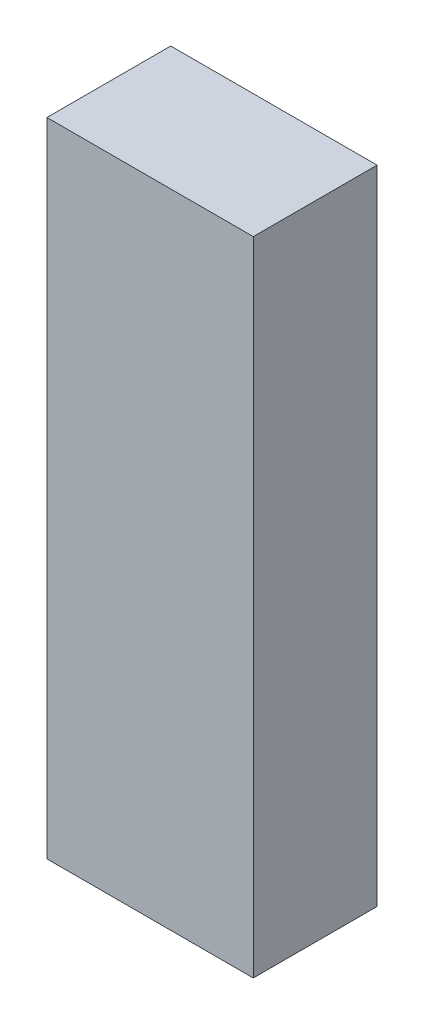
ISO-10303-21;
HEADER;
FILE_DESCRIPTION(('STEP AP214'),'2;1');
FILE_NAME('part.step','',(''),(''),'','','');
FILE_SCHEMA(('AUTOMOTIVE_DESIGN { 1 0 10303 214 1 1 1 1 }'));
ENDSEC;
DATA;
#1=APPLICATION_CONTEXT('core data for automotive mechanical design processes');
#2=APPLICATION_PROTOCOL_DEFINITION('international standard','automotive_design',2000,#1);
#3=PRODUCT_CONTEXT('',#1,'mechanical');
#4=PRODUCT('Part','Part','',(#3));
#5=PRODUCT_RELATED_PRODUCT_CATEGORY('part','',(#4));
#6=PRODUCT_DEFINITION_FORMATION('','',#4);
#7=PRODUCT_DEFINITION_CONTEXT('part definition',#1,'design');
#8=PRODUCT_DEFINITION('design','',#6,#7);
#9=PRODUCT_DEFINITION_SHAPE('','',#8);
#10=(LENGTH_UNIT() NAMED_UNIT(*) SI_UNIT(.MILLI.,.METRE.));
#11=(NAMED_UNIT(*) PLANE_ANGLE_UNIT() SI_UNIT($,.RADIAN.));
#12=(NAMED_UNIT(*) SI_UNIT($,.STERADIAN.) SOLID_ANGLE_UNIT());
#13=UNCERTAINTY_MEASURE_WITH_UNIT(LENGTH_MEASURE(1.E-05),#10,'distance_accuracy_value','');
#14=(GEOMETRIC_REPRESENTATION_CONTEXT(3) GLOBAL_UNCERTAINTY_ASSIGNED_CONTEXT((#13)) GLOBAL_UNIT_ASSIGNED_CONTEXT((#10,
#11,#12)) REPRESENTATION_CONTEXT('',''));
#15=CARTESIAN_POINT('',(0.,0.,0.));
#16=DIRECTION('',(0.,0.,1.));
#17=DIRECTION('',(1.,0.,0.));
#18=AXIS2_PLACEMENT_3D('',#15,#16,#17);
#19=CARTESIAN_POINT('',(25.4,-79.0361688372541,30.48));
#20=DIRECTION('',(-1.,0.,0.));
#21=DIRECTION('',(0.,0.,1.));
#22=AXIS2_PLACEMENT_3D('',#19,#20,#21);
#23=PLANE('',#22);
#24=DIRECTION('',(0.,1.,0.));
#25=VECTOR('',#24,1.);
#26=CARTESIAN_POINT('',(25.4,-79.0361688372541,0.));
#27=LINE('',#26,#25);
#28=CARTESIAN_POINT('',(25.4,-79.0361688372541,0.));
#29=VERTEX_POINT('',#28);
#30=CARTESIAN_POINT('',(25.4,79.0361688372541,0.));
#31=VERTEX_POINT('',#30);
#32=EDGE_CURVE('E96',#29,#31,#27,.T.);
#33=ORIENTED_EDGE('',*,*,#32,.T.);
#34=DIRECTION('',(0.,0.,-1.));
#35=VECTOR('',#34,1.);
#36=CARTESIAN_POINT('',(25.4,79.0361688372541,30.48));
#37=LINE('',#36,#35);
#38=CARTESIAN_POINT('',(25.4,79.0361688372541,30.48));
#39=VERTEX_POINT('',#38);
#40=EDGE_CURVE('E11',#39,#31,#37,.T.);
#41=ORIENTED_EDGE('',*,*,#40,.F.);
#42=DIRECTION('',(0.,1.,0.));
#43=VECTOR('',#42,1.);
#44=CARTESIAN_POINT('',(25.4,-79.0361688372541,30.48));
#45=LINE('',#44,#43);
#46=CARTESIAN_POINT('',(25.4,-79.0361688372541,30.48));
#47=VERTEX_POINT('',#46);
#48=EDGE_CURVE('E84',#47,#39,#45,.T.);
#49=ORIENTED_EDGE('',*,*,#48,.F.);
#50=DIRECTION('',(0.,0.,-1.));
#51=VECTOR('',#50,1.);
#52=CARTESIAN_POINT('',(25.4,-79.0361688372541,30.48));
#53=LINE('',#52,#51);
#54=EDGE_CURVE('E92',#47,#29,#53,.T.);
#55=ORIENTED_EDGE('',*,*,#54,.T.);
#56=EDGE_LOOP('',(#33,#41,#49,#55));
#57=FACE_BOUND('',#56,.T.);
#58=ADVANCED_FACE('F33',(#57),#23,.F.);
#59=CARTESIAN_POINT('',(-25.4,79.0361688372541,30.48));
#60=DIRECTION('',(0.,-1.,0.));
#61=DIRECTION('',(0.,0.,-1.));
#62=AXIS2_PLACEMENT_3D('',#59,#60,#61);
#63=PLANE('',#62);
#64=DIRECTION('',(-1.,0.,0.));
#65=VECTOR('',#64,1.);
#66=CARTESIAN_POINT('',(-25.4,79.0361688372541,0.));
#67=LINE('',#66,#65);
#68=CARTESIAN_POINT('',(-25.4,79.0361688372541,0.));
#69=VERTEX_POINT('',#68);
#70=EDGE_CURVE('E88',#31,#69,#67,.T.);
#71=ORIENTED_EDGE('',*,*,#70,.T.);
#72=DIRECTION('',(0.,0.,-1.));
#73=VECTOR('',#72,1.);
#74=CARTESIAN_POINT('',(-25.4,79.0361688372541,30.48));
#75=LINE('',#74,#73);
#76=CARTESIAN_POINT('',(-25.4,79.0361688372541,30.48));
#77=VERTEX_POINT('',#76);
#78=EDGE_CURVE('E41',#77,#69,#75,.T.);
#79=ORIENTED_EDGE('',*,*,#78,.F.);
#80=DIRECTION('',(-1.,0.,0.));
#81=VECTOR('',#80,1.);
#82=CARTESIAN_POINT('',(-25.4,79.0361688372541,30.48));
#83=LINE('',#82,#81);
#84=EDGE_CURVE('E79',#39,#77,#83,.T.);
#85=ORIENTED_EDGE('',*,*,#84,.F.);
#86=ORIENTED_EDGE('',*,*,#40,.T.);
#87=EDGE_LOOP('',(#71,#79,#85,#86));
#88=FACE_BOUND('',#87,.T.);
#89=ADVANCED_FACE('F87',(#88),#63,.F.);
#90=CARTESIAN_POINT('',(-25.4,-79.0361688372541,30.48));
#91=DIRECTION('',(1.,0.,0.));
#92=DIRECTION('',(0.,0.,-1.));
#93=AXIS2_PLACEMENT_3D('',#90,#91,#92);
#94=PLANE('',#93);
#95=DIRECTION('',(0.,-1.,0.));
#96=VECTOR('',#95,1.);
#97=CARTESIAN_POINT('',(-25.4,-79.0361688372541,0.));
#98=LINE('',#97,#96);
#99=CARTESIAN_POINT('',(-25.4,-79.0361688372541,0.));
#100=VERTEX_POINT('',#99);
#101=EDGE_CURVE('E66',#69,#100,#98,.T.);
#102=ORIENTED_EDGE('',*,*,#101,.T.);
#103=DIRECTION('',(0.,0.,-1.));
#104=VECTOR('',#103,1.);
#105=CARTESIAN_POINT('',(-25.4,-79.0361688372541,30.48));
#106=LINE('',#105,#104);
#107=CARTESIAN_POINT('',(-25.4,-79.0361688372541,30.48));
#108=VERTEX_POINT('',#107);
#109=EDGE_CURVE('E89',#108,#100,#106,.T.);
#110=ORIENTED_EDGE('',*,*,#109,.F.);
#111=DIRECTION('',(0.,-1.,0.));
#112=VECTOR('',#111,1.);
#113=CARTESIAN_POINT('',(-25.4,-79.0361688372541,30.48));
#114=LINE('',#113,#112);
#115=EDGE_CURVE('E82',#77,#108,#114,.T.);
#116=ORIENTED_EDGE('',*,*,#115,.F.);
#117=ORIENTED_EDGE('',*,*,#78,.T.);
#118=EDGE_LOOP('',(#102,#110,#116,#117));
#119=FACE_BOUND('',#118,.T.);
#120=ADVANCED_FACE('F90',(#119),#94,.F.);
#121=CARTESIAN_POINT('',(-25.4,-79.0361688372541,30.48));
#122=DIRECTION('',(0.,1.,0.));
#123=DIRECTION('',(0.,0.,1.));
#124=AXIS2_PLACEMENT_3D('',#121,#122,#123);
#125=PLANE('',#124);
#126=DIRECTION('',(1.,0.,0.));
#127=VECTOR('',#126,1.);
#128=CARTESIAN_POINT('',(-25.4,-79.0361688372541,0.));
#129=LINE('',#128,#127);
#130=EDGE_CURVE('E72',#100,#29,#129,.T.);
#131=ORIENTED_EDGE('',*,*,#130,.T.);
#132=ORIENTED_EDGE('',*,*,#54,.F.);
#133=DIRECTION('',(1.,0.,0.));
#134=VECTOR('',#133,1.);
#135=CARTESIAN_POINT('',(-25.4,-79.0361688372541,30.48));
#136=LINE('',#135,#134);
#137=EDGE_CURVE('E49',#108,#47,#136,.T.);
#138=ORIENTED_EDGE('',*,*,#137,.F.);
#139=ORIENTED_EDGE('',*,*,#109,.T.);
#140=EDGE_LOOP('',(#131,#132,#138,#139));
#141=FACE_BOUND('',#140,.T.);
#142=ADVANCED_FACE('F103',(#141),#125,.F.);
#143=CARTESIAN_POINT('',(0.,0.,30.48));
#144=DIRECTION('',(0.,0.,-1.));
#145=DIRECTION('',(-1.,0.,0.));
#146=AXIS2_PLACEMENT_3D('',#143,#144,#145);
#147=PLANE('',#146);
#148=ORIENTED_EDGE('',*,*,#48,.T.);
#149=ORIENTED_EDGE('',*,*,#84,.T.);
#150=ORIENTED_EDGE('',*,*,#115,.T.);
#151=ORIENTED_EDGE('',*,*,#137,.T.);
#152=EDGE_LOOP('',(#148,#149,#150,#151));
#153=FACE_BOUND('',#152,.T.);
#154=ADVANCED_FACE('F80',(#153),#147,.F.);
#155=CARTESIAN_POINT('',(0.,0.,0.));
#156=DIRECTION('',(0.,0.,-1.));
#157=DIRECTION('',(-1.,0.,0.));
#158=AXIS2_PLACEMENT_3D('',#155,#156,#157);
#159=PLANE('',#158);
#160=ORIENTED_EDGE('',*,*,#32,.F.);
#161=ORIENTED_EDGE('',*,*,#130,.F.);
#162=ORIENTED_EDGE('',*,*,#101,.F.);
#163=ORIENTED_EDGE('',*,*,#70,.F.);
#164=EDGE_LOOP('',(#160,#161,#162,#163));
#165=FACE_BOUND('',#164,.T.);
#166=ADVANCED_FACE('F106',(#165),#159,.T.);
#167=CLOSED_SHELL('',(#58,#89,#120,#142,#154,#166));
#168=MANIFOLD_SOLID_BREP('B2',#167);
#169=ADVANCED_BREP_SHAPE_REPRESENTATION('',(#18,#168),#14);
#170=SHAPE_DEFINITION_REPRESENTATION(#9,#169);
ENDSEC;
END-ISO-10303-21;
